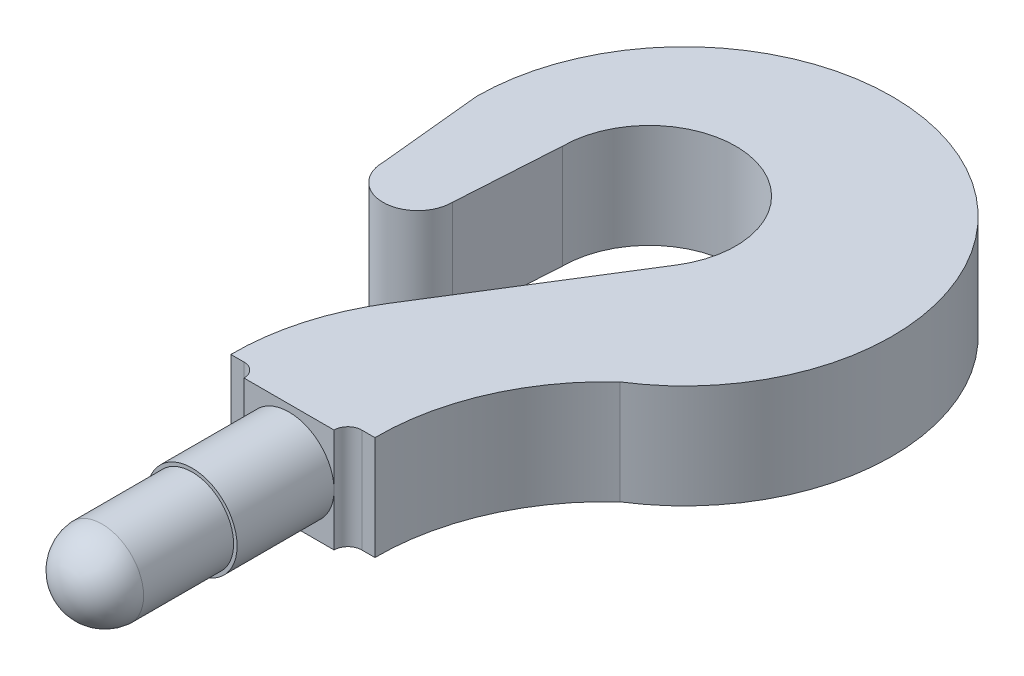
ISO-10303-21;
HEADER;
FILE_DESCRIPTION(('STEP AP214'),'2;1');
FILE_NAME('part.step','',(''),(''),'','','');
FILE_SCHEMA(('AUTOMOTIVE_DESIGN { 1 0 10303 214 1 1 1 1 }'));
ENDSEC;
DATA;
#1=APPLICATION_CONTEXT('core data for automotive mechanical design processes');
#2=APPLICATION_PROTOCOL_DEFINITION('international standard','automotive_design',2000,#1);
#3=PRODUCT_CONTEXT('',#1,'mechanical');
#4=PRODUCT('Part','Part','',(#3));
#5=PRODUCT_RELATED_PRODUCT_CATEGORY('part','',(#4));
#6=PRODUCT_DEFINITION_FORMATION('','',#4);
#7=PRODUCT_DEFINITION_CONTEXT('part definition',#1,'design');
#8=PRODUCT_DEFINITION('design','',#6,#7);
#9=PRODUCT_DEFINITION_SHAPE('','',#8);
#10=(LENGTH_UNIT() NAMED_UNIT(*) SI_UNIT(.MILLI.,.METRE.));
#11=(NAMED_UNIT(*) PLANE_ANGLE_UNIT() SI_UNIT($,.RADIAN.));
#12=(NAMED_UNIT(*) SI_UNIT($,.STERADIAN.) SOLID_ANGLE_UNIT());
#13=UNCERTAINTY_MEASURE_WITH_UNIT(LENGTH_MEASURE(1.E-05),#10,'distance_accuracy_value','');
#14=(GEOMETRIC_REPRESENTATION_CONTEXT(3) GLOBAL_UNCERTAINTY_ASSIGNED_CONTEXT((#13)) GLOBAL_UNIT_ASSIGNED_CONTEXT((#10,
#11,#12)) REPRESENTATION_CONTEXT('',''));
#15=CARTESIAN_POINT('',(0.,0.,0.));
#16=DIRECTION('',(0.,0.,1.));
#17=DIRECTION('',(1.,0.,0.));
#18=AXIS2_PLACEMENT_3D('',#15,#16,#17);
#19=CARTESIAN_POINT('',(0.,0.,14.));
#20=DIRECTION('',(0.,0.,-1.));
#21=DIRECTION('',(-1.,0.,0.));
#22=AXIS2_PLACEMENT_3D('',#19,#20,#21);
#23=CYLINDRICAL_SURFACE('',#22,6.5);
#24=CARTESIAN_POINT('',(0.,0.,14.));
#25=DIRECTION('',(0.,0.,1.));
#26=DIRECTION('',(1.,0.,0.));
#27=AXIS2_PLACEMENT_3D('',#24,#25,#26);
#28=CIRCLE('',#27,6.5);
#29=CARTESIAN_POINT('',(6.5,0.,14.));
#30=VERTEX_POINT('',#29);
#31=EDGE_CURVE('E182',#30,#30,#28,.T.);
#32=ORIENTED_EDGE('',*,*,#31,.F.);
#33=EDGE_LOOP('',(#32));
#34=FACE_BOUND('',#33,.T.);
#35=CARTESIAN_POINT('',(0.,0.,0.));
#36=DIRECTION('',(0.,0.,1.));
#37=DIRECTION('',(1.,0.,0.));
#38=AXIS2_PLACEMENT_3D('',#35,#36,#37);
#39=CIRCLE('',#38,6.5);
#40=CARTESIAN_POINT('',(6.5,0.,0.));
#41=VERTEX_POINT('',#40);
#42=CARTESIAN_POINT('',(-6.5,0.,0.));
#43=VERTEX_POINT('',#42);
#44=EDGE_CURVE('E160',#41,#43,#39,.T.);
#45=ORIENTED_EDGE('',*,*,#44,.T.);
#46=EDGE_CURVE('E180',#43,#41,#39,.T.);
#47=ORIENTED_EDGE('',*,*,#46,.T.);
#48=EDGE_LOOP('',(#45,#47));
#49=FACE_BOUND('',#48,.T.);
#50=ADVANCED_FACE('F43',(#34,#49),#23,.T.);
#51=CARTESIAN_POINT('',(0.,0.,14.));
#52=DIRECTION('',(0.,0.,1.));
#53=DIRECTION('',(1.,0.,0.));
#54=AXIS2_PLACEMENT_3D('',#51,#52,#53);
#55=PLANE('',#54);
#56=CARTESIAN_POINT('',(0.,0.,14.));
#57=DIRECTION('',(0.,0.,1.));
#58=DIRECTION('',(1.,0.,0.));
#59=AXIS2_PLACEMENT_3D('',#56,#57,#58);
#60=CIRCLE('',#59,6.);
#61=CARTESIAN_POINT('',(-6.,0.,14.));
#62=VERTEX_POINT('',#61);
#63=EDGE_CURVE('E177',#62,#62,#60,.T.);
#64=ORIENTED_EDGE('',*,*,#63,.F.);
#65=EDGE_LOOP('',(#64));
#66=FACE_BOUND('',#65,.T.);
#67=ORIENTED_EDGE('',*,*,#31,.T.);
#68=EDGE_LOOP('',(#67));
#69=FACE_BOUND('',#68,.T.);
#70=ADVANCED_FACE('F318',(#66,#69),#55,.T.);
#71=CARTESIAN_POINT('',(0.,0.,27.));
#72=DIRECTION('',(0.,0.,-1.));
#73=DIRECTION('',(-1.,0.,0.));
#74=AXIS2_PLACEMENT_3D('',#71,#72,#73);
#75=CYLINDRICAL_SURFACE('',#74,6.);
#76=CARTESIAN_POINT('',(0.,0.,27.));
#77=DIRECTION('',(0.,0.,1.));
#78=DIRECTION('',(1.,0.,0.));
#79=AXIS2_PLACEMENT_3D('',#76,#77,#78);
#80=CIRCLE('',#79,6.);
#81=CARTESIAN_POINT('',(-6.,0.,27.));
#82=VERTEX_POINT('',#81);
#83=EDGE_CURVE('E164',#82,#82,#80,.T.);
#84=CARTESIAN_POINT('',(-6.,0.,27.));
#85=CARTESIAN_POINT('',(-6.,0.,26.8645833333333));
#86=CARTESIAN_POINT('',(-6.,0.,26.7291666666667));
#87=CARTESIAN_POINT('',(-6.,0.,26.4583333333333));
#88=CARTESIAN_POINT('',(-6.,0.,26.3229166666667));
#89=CARTESIAN_POINT('',(-6.,0.,26.0520833333333));
#90=CARTESIAN_POINT('',(-6.,0.,25.9166666666667));
#91=CARTESIAN_POINT('',(-6.,0.,25.6458333333333));
#92=CARTESIAN_POINT('',(-6.,0.,25.5104166666667));
#93=CARTESIAN_POINT('',(-6.,0.,25.2395833333333));
#94=CARTESIAN_POINT('',(-6.,0.,25.1041666666667));
#95=CARTESIAN_POINT('',(-6.,0.,24.8333333333333));
#96=CARTESIAN_POINT('',(-6.,0.,24.6979166666667));
#97=CARTESIAN_POINT('',(-6.,0.,24.4270833333333));
#98=CARTESIAN_POINT('',(-6.,0.,24.2916666666667));
#99=CARTESIAN_POINT('',(-6.,0.,24.0208333333333));
#100=CARTESIAN_POINT('',(-6.,0.,23.8854166666667));
#101=CARTESIAN_POINT('',(-6.,0.,23.6145833333333));
#102=CARTESIAN_POINT('',(-6.,0.,23.4791666666667));
#103=CARTESIAN_POINT('',(-6.,0.,23.2083333333333));
#104=CARTESIAN_POINT('',(-6.,0.,23.0729166666667));
#105=CARTESIAN_POINT('',(-6.,0.,22.8020833333333));
#106=CARTESIAN_POINT('',(-6.,0.,22.6666666666667));
#107=CARTESIAN_POINT('',(-6.,0.,22.3958333333333));
#108=CARTESIAN_POINT('',(-6.,0.,22.2604166666667));
#109=CARTESIAN_POINT('',(-6.,0.,21.9895833333333));
#110=CARTESIAN_POINT('',(-6.,0.,21.8541666666667));
#111=CARTESIAN_POINT('',(-6.,0.,21.5833333333333));
#112=CARTESIAN_POINT('',(-6.,0.,21.4479166666667));
#113=CARTESIAN_POINT('',(-6.,0.,21.1770833333333));
#114=CARTESIAN_POINT('',(-6.,0.,21.0416666666667));
#115=CARTESIAN_POINT('',(-6.,0.,20.7708333333333));
#116=CARTESIAN_POINT('',(-6.,0.,20.6354166666667));
#117=CARTESIAN_POINT('',(-6.,0.,20.3645833333333));
#118=CARTESIAN_POINT('',(-6.,0.,20.2291666666667));
#119=CARTESIAN_POINT('',(-6.,0.,19.9583333333333));
#120=CARTESIAN_POINT('',(-6.,0.,19.8229166666667));
#121=CARTESIAN_POINT('',(-6.,0.,19.5520833333333));
#122=CARTESIAN_POINT('',(-6.,0.,19.4166666666667));
#123=CARTESIAN_POINT('',(-6.,0.,19.1458333333333));
#124=CARTESIAN_POINT('',(-6.,0.,19.0104166666667));
#125=CARTESIAN_POINT('',(-6.,0.,18.7395833333333));
#126=CARTESIAN_POINT('',(-6.,0.,18.6041666666667));
#127=CARTESIAN_POINT('',(-6.,0.,18.3333333333333));
#128=CARTESIAN_POINT('',(-6.,0.,18.1979166666667));
#129=CARTESIAN_POINT('',(-6.,0.,17.9270833333333));
#130=CARTESIAN_POINT('',(-6.,0.,17.7916666666667));
#131=CARTESIAN_POINT('',(-6.,0.,17.5208333333333));
#132=CARTESIAN_POINT('',(-6.,0.,17.3854166666667));
#133=CARTESIAN_POINT('',(-6.,0.,17.1145833333333));
#134=CARTESIAN_POINT('',(-6.,0.,16.9791666666667));
#135=CARTESIAN_POINT('',(-6.,0.,16.7083333333333));
#136=CARTESIAN_POINT('',(-6.,0.,16.5729166666667));
#137=CARTESIAN_POINT('',(-6.,0.,16.3020833333333));
#138=CARTESIAN_POINT('',(-6.,0.,16.1666666666667));
#139=CARTESIAN_POINT('',(-6.,0.,15.8958333333333));
#140=CARTESIAN_POINT('',(-6.,0.,15.7604166666667));
#141=CARTESIAN_POINT('',(-6.,0.,15.4895833333333));
#142=CARTESIAN_POINT('',(-6.,0.,15.3541666666667));
#143=CARTESIAN_POINT('',(-6.,0.,15.0833333333333));
#144=CARTESIAN_POINT('',(-6.,0.,14.9479166666667));
#145=CARTESIAN_POINT('',(-6.,0.,14.6770833333333));
#146=CARTESIAN_POINT('',(-6.,0.,14.5416666666667));
#147=CARTESIAN_POINT('',(-6.,0.,14.2708333333333));
#148=CARTESIAN_POINT('',(-6.,0.,14.1354166666667));
#149=CARTESIAN_POINT('',(-6.,0.,14.));
#150=B_SPLINE_CURVE_WITH_KNOTS('',3,(#84,#85,#86,#87,#88,#89,#90,#91,#92,#93,#94,#95,#96,#97,
#98,#99,#100,#101,#102,#103,#104,#105,#106,#107,#108,#109,#110,#111,#112,#113,#114,#115,#116,
#117,#118,#119,#120,#121,#122,#123,#124,#125,#126,#127,#128,#129,#130,#131,#132,#133,#134,#135,
#136,#137,#138,#139,#140,#141,#142,#143,#144,#145,#146,#147,#148,#149),.UNSPECIFIED.,.F.,.F.,(4,
2,2,2,2,2,2,2,2,2,2,2,2,2,2,2,2,2,2,2,2,2,2,2,2,2,2,2,2,2,2,2,4),(0.,0.406249999999997,
0.812499999999997,1.21875,1.625,2.03125,2.4375,2.84375,3.25,3.65625,4.0625,4.46875,4.875,
5.28125,5.6875,6.09374999999999,6.5,6.90625,7.3125,7.71875,8.125,8.53125,8.93749999999999,
9.34375,9.74999999999999,10.15625,10.5625,10.96875,11.375,11.78125,12.1875,12.59375,13.),.UNSPECIFIED.);
#151=EDGE_CURVE('BSEAM326',#82,#62,#150,.T.);
#152=ORIENTED_EDGE('',*,*,#83,.F.);
#153=ORIENTED_EDGE('',*,*,#63,.T.);
#154=ORIENTED_EDGE('',*,*,#151,.T.);
#155=ORIENTED_EDGE('',*,*,#151,.F.);
#156=EDGE_LOOP('',(#152,#154,#153,#155));
#157=FACE_BOUND('',#156,.T.);
#158=ADVANCED_FACE('F326',(#157),#75,.T.);
#159=CARTESIAN_POINT('',(0.,0.,26.5964438502674));
#160=DIRECTION('',(0.,0.,1.));
#161=DIRECTION('',(1.,0.,0.));
#162=AXIS2_PLACEMENT_3D('',#159,#160,#161);
#163=SPHERICAL_SURFACE('',#162,6.01355614973262);
#164=ORIENTED_EDGE('',*,*,#83,.T.);
#165=EDGE_LOOP('',(#164));
#166=FACE_BOUND('',#165,.T.);
#167=ADVANCED_FACE('F332',(#166),#163,.T.);
#168=CARTESIAN_POINT('',(0.,7.5,0.));
#169=DIRECTION('',(0.,0.,-1.));
#170=DIRECTION('',(-1.,0.,0.));
#171=AXIS2_PLACEMENT_3D('',#168,#169,#170);
#172=PLANE('',#171);
#173=ORIENTED_EDGE('',*,*,#44,.F.);
#174=DIRECTION('',(0.,-1.,0.));
#175=VECTOR('',#174,1.);
#176=CARTESIAN_POINT('',(6.5,7.5,0.));
#177=LINE('',#176,#175);
#178=CARTESIAN_POINT('',(6.5,7.5,0.));
#179=VERTEX_POINT('',#178);
#180=EDGE_CURVE('E157',#179,#41,#177,.T.);
#181=ORIENTED_EDGE('',*,*,#180,.F.);
#182=DIRECTION('',(1.,0.,0.));
#183=VECTOR('',#182,1.);
#184=CARTESIAN_POINT('',(0.,7.5,0.));
#185=LINE('',#184,#183);
#186=CARTESIAN_POINT('',(-6.5,7.5,0.));
#187=VERTEX_POINT('',#186);
#188=EDGE_CURVE('E142',#187,#179,#185,.T.);
#189=ORIENTED_EDGE('',*,*,#188,.F.);
#190=DIRECTION('',(0.,-1.,0.));
#191=VECTOR('',#190,1.);
#192=CARTESIAN_POINT('',(-6.5,7.5,0.));
#193=LINE('',#192,#191);
#194=EDGE_CURVE('E210',#187,#43,#193,.T.);
#195=ORIENTED_EDGE('',*,*,#194,.T.);
#196=EDGE_LOOP('',(#173,#181,#189,#195));
#197=FACE_BOUND('',#196,.T.);
#198=ADVANCED_FACE('F158',(#197),#172,.F.);
#199=ORIENTED_EDGE('',*,*,#46,.F.);
#200=CARTESIAN_POINT('',(-6.5,-7.5,0.));
#201=VERTEX_POINT('',#200);
#202=EDGE_CURVE('E212',#43,#201,#193,.T.);
#203=ORIENTED_EDGE('',*,*,#202,.T.);
#204=DIRECTION('',(1.,0.,0.));
#205=VECTOR('',#204,1.);
#206=CARTESIAN_POINT('',(0.,-7.5,0.));
#207=LINE('',#206,#205);
#208=CARTESIAN_POINT('',(6.5,-7.5,0.));
#209=VERTEX_POINT('',#208);
#210=EDGE_CURVE('E237',#201,#209,#207,.T.);
#211=ORIENTED_EDGE('',*,*,#210,.T.);
#212=EDGE_CURVE('E165',#41,#209,#177,.T.);
#213=ORIENTED_EDGE('',*,*,#212,.F.);
#214=EDGE_LOOP('',(#199,#203,#211,#213));
#215=FACE_BOUND('',#214,.T.);
#216=ADVANCED_FACE('F306',(#215),#172,.F.);
#217=CARTESIAN_POINT('',(0.,7.5,-2.));
#218=DIRECTION('',(0.,0.,-1.));
#219=DIRECTION('',(-1.,0.,0.));
#220=AXIS2_PLACEMENT_3D('',#217,#218,#219);
#221=PLANE('',#220);
#222=DIRECTION('',(1.,0.,0.));
#223=VECTOR('',#222,1.);
#224=CARTESIAN_POINT('',(0.,7.5,-2.));
#225=LINE('',#224,#223);
#226=CARTESIAN_POINT('',(8.5,7.5,-2.));
#227=VERTEX_POINT('',#226);
#228=CARTESIAN_POINT('',(10.4014134236338,7.5,-2.));
#229=VERTEX_POINT('',#228);
#230=EDGE_CURVE('E152',#227,#229,#225,.T.);
#231=ORIENTED_EDGE('',*,*,#230,.F.);
#232=DIRECTION('',(0.,-1.,0.));
#233=VECTOR('',#232,1.);
#234=CARTESIAN_POINT('',(8.5,-7.5,-2.));
#235=LINE('',#234,#233);
#236=CARTESIAN_POINT('',(8.5,-7.5,-2.));
#237=VERTEX_POINT('',#236);
#238=EDGE_CURVE('E170',#227,#237,#235,.T.);
#239=ORIENTED_EDGE('',*,*,#238,.T.);
#240=DIRECTION('',(1.,0.,0.));
#241=VECTOR('',#240,1.);
#242=CARTESIAN_POINT('',(0.,-7.5,-2.));
#243=LINE('',#242,#241);
#244=CARTESIAN_POINT('',(10.4014134236338,-7.5,-2.));
#245=VERTEX_POINT('',#244);
#246=EDGE_CURVE('E235',#237,#245,#243,.T.);
#247=ORIENTED_EDGE('',*,*,#246,.T.);
#248=DIRECTION('',(0.,-1.,0.));
#249=VECTOR('',#248,1.);
#250=CARTESIAN_POINT('',(10.4014134236338,7.5,-2.));
#251=LINE('',#250,#249);
#252=EDGE_CURVE('E187',#229,#245,#251,.T.);
#253=ORIENTED_EDGE('',*,*,#252,.F.);
#254=EDGE_LOOP('',(#231,#239,#247,#253));
#255=FACE_BOUND('',#254,.T.);
#256=ADVANCED_FACE('F265',(#255),#221,.F.);
#257=CARTESIAN_POINT('',(43.4,7.5,-2.30542423293425));
#258=DIRECTION('',(0.,-1.,0.));
#259=DIRECTION('',(0.,0.,-1.));
#260=AXIS2_PLACEMENT_3D('',#257,#258,#259);
#261=CYLINDRICAL_SURFACE('',#260,33.);
#262=CARTESIAN_POINT('',(43.4,-7.5,-2.30542423293425));
#263=DIRECTION('',(0.,1.,0.));
#264=DIRECTION('',(0.,0.,1.));
#265=AXIS2_PLACEMENT_3D('',#262,#263,#264);
#266=CIRCLE('',#265,33.);
#267=CARTESIAN_POINT('',(21.139966272595,-7.5,-26.6670928632804));
#268=VERTEX_POINT('',#267);
#269=EDGE_CURVE('E232',#268,#245,#266,.T.);
#270=ORIENTED_EDGE('',*,*,#269,.F.);
#271=DIRECTION('',(0.,-1.,0.));
#272=VECTOR('',#271,1.);
#273=CARTESIAN_POINT('',(21.139966272595,7.5,-26.6670928632804));
#274=LINE('',#273,#272);
#275=CARTESIAN_POINT('',(21.139966272595,7.5,-26.6670928632804));
#276=VERTEX_POINT('',#275);
#277=EDGE_CURVE('E190',#276,#268,#274,.T.);
#278=ORIENTED_EDGE('',*,*,#277,.F.);
#279=CARTESIAN_POINT('',(43.4,7.5,-2.30542423293425));
#280=DIRECTION('',(0.,1.,0.));
#281=DIRECTION('',(0.,0.,1.));
#282=AXIS2_PLACEMENT_3D('',#279,#280,#281);
#283=CIRCLE('',#282,33.);
#284=EDGE_CURVE('E259',#276,#229,#283,.T.);
#285=ORIENTED_EDGE('',*,*,#284,.T.);
#286=ORIENTED_EDGE('',*,*,#252,.T.);
#287=EDGE_LOOP('',(#270,#278,#285,#286));
#288=FACE_BOUND('',#287,.T.);
#289=ADVANCED_FACE('F269',(#288),#261,.F.);
#290=CARTESIAN_POINT('',(5.07,7.5,-52.));
#291=DIRECTION('',(0.,-1.,0.));
#292=DIRECTION('',(0.,0.,-1.));
#293=AXIS2_PLACEMENT_3D('',#290,#291,#292);
#294=CYLINDRICAL_SURFACE('',#293,30.);
#295=CARTESIAN_POINT('',(5.07,-7.5,-52.));
#296=DIRECTION('',(0.,1.,0.));
#297=DIRECTION('',(0.,0.,1.));
#298=AXIS2_PLACEMENT_3D('',#295,#296,#297);
#299=CIRCLE('',#298,30.);
#300=CARTESIAN_POINT('',(-24.93,-7.5,-51.9999999999998));
#301=VERTEX_POINT('',#300);
#302=EDGE_CURVE('E230',#268,#301,#299,.T.);
#303=ORIENTED_EDGE('',*,*,#302,.T.);
#304=DIRECTION('',(0.,-1.,0.));
#305=VECTOR('',#304,1.);
#306=CARTESIAN_POINT('',(-24.93,7.5,-51.9999999999998));
#307=LINE('',#306,#305);
#308=CARTESIAN_POINT('',(-24.93,7.5,-51.9999999999998));
#309=VERTEX_POINT('',#308);
#310=EDGE_CURVE('E192',#309,#301,#307,.T.);
#311=ORIENTED_EDGE('',*,*,#310,.F.);
#312=CARTESIAN_POINT('',(5.07,7.5,-52.));
#313=DIRECTION('',(0.,1.,0.));
#314=DIRECTION('',(0.,0.,1.));
#315=AXIS2_PLACEMENT_3D('',#312,#313,#314);
#316=CIRCLE('',#315,30.);
#317=EDGE_CURVE('E257',#276,#309,#316,.T.);
#318=ORIENTED_EDGE('',*,*,#317,.F.);
#319=ORIENTED_EDGE('',*,*,#277,.T.);
#320=EDGE_LOOP('',(#303,#311,#318,#319));
#321=FACE_BOUND('',#320,.T.);
#322=ADVANCED_FACE('F274',(#321),#294,.T.);
#323=CARTESIAN_POINT('',(-19.5346534653465,7.5,1.95346534653468));
#324=DIRECTION('',(0.995037190209989,0.,-0.0995037190210004));
#325=DIRECTION('',(-0.0995037190210004,0.,-0.995037190209989));
#326=AXIS2_PLACEMENT_3D('',#323,#324,#325);
#327=PLANE('',#326);
#328=DIRECTION('',(0.0995037190210004,0.,0.995037190209989));
#329=VECTOR('',#328,1.);
#330=CARTESIAN_POINT('',(-19.5346534653465,-7.5,1.95346534653468));
#331=LINE('',#330,#329);
#332=CARTESIAN_POINT('',(-23.43,-7.5,-37.));
#333=VERTEX_POINT('',#332);
#334=EDGE_CURVE('E228',#301,#333,#331,.T.);
#335=ORIENTED_EDGE('',*,*,#334,.T.);
#336=DIRECTION('',(0.,-1.,0.));
#337=VECTOR('',#336,1.);
#338=CARTESIAN_POINT('',(-23.43,7.5,-37.));
#339=LINE('',#338,#337);
#340=CARTESIAN_POINT('',(-23.43,7.5,-37.));
#341=VERTEX_POINT('',#340);
#342=EDGE_CURVE('E195',#341,#333,#339,.T.);
#343=ORIENTED_EDGE('',*,*,#342,.F.);
#344=DIRECTION('',(0.0995037190210004,0.,0.995037190209989));
#345=VECTOR('',#344,1.);
#346=CARTESIAN_POINT('',(-19.5346534653465,7.5,1.95346534653468));
#347=LINE('',#346,#345);
#348=EDGE_CURVE('E255',#309,#341,#347,.T.);
#349=ORIENTED_EDGE('',*,*,#348,.F.);
#350=ORIENTED_EDGE('',*,*,#310,.T.);
#351=EDGE_LOOP('',(#335,#343,#349,#350));
#352=FACE_BOUND('',#351,.T.);
#353=ADVANCED_FACE('F280',(#352),#327,.F.);
#354=CARTESIAN_POINT('',(-18.43,7.5,-37.));
#355=DIRECTION('',(0.,-1.,0.));
#356=DIRECTION('',(0.,0.,-1.));
#357=AXIS2_PLACEMENT_3D('',#354,#355,#356);
#358=CYLINDRICAL_SURFACE('',#357,5.);
#359=CARTESIAN_POINT('',(-18.43,-7.5,-37.));
#360=DIRECTION('',(0.,1.,0.));
#361=DIRECTION('',(0.,0.,1.));
#362=AXIS2_PLACEMENT_3D('',#359,#360,#361);
#363=CIRCLE('',#362,5.);
#364=CARTESIAN_POINT('',(-13.43,-7.5,-37.));
#365=VERTEX_POINT('',#364);
#366=EDGE_CURVE('E226',#333,#365,#363,.T.);
#367=ORIENTED_EDGE('',*,*,#366,.T.);
#368=DIRECTION('',(0.,-1.,0.));
#369=VECTOR('',#368,1.);
#370=CARTESIAN_POINT('',(-13.43,7.5,-37.));
#371=LINE('',#370,#369);
#372=CARTESIAN_POINT('',(-13.43,7.5,-37.));
#373=VERTEX_POINT('',#372);
#374=EDGE_CURVE('E198',#373,#365,#371,.T.);
#375=ORIENTED_EDGE('',*,*,#374,.F.);
#376=CARTESIAN_POINT('',(-18.43,7.5,-37.));
#377=DIRECTION('',(0.,1.,0.));
#378=DIRECTION('',(0.,0.,1.));
#379=AXIS2_PLACEMENT_3D('',#376,#377,#378);
#380=CIRCLE('',#379,5.);
#381=EDGE_CURVE('E253',#341,#373,#380,.T.);
#382=ORIENTED_EDGE('',*,*,#381,.F.);
#383=ORIENTED_EDGE('',*,*,#342,.T.);
#384=EDGE_LOOP('',(#367,#375,#382,#383));
#385=FACE_BOUND('',#384,.T.);
#386=ADVANCED_FACE('F284',(#385),#358,.T.);
#387=CARTESIAN_POINT('',(-15.6637883974004,7.5,-0.97115488063882));
#388=DIRECTION('',(-0.998083523435423,0.,-0.061881178452996));
#389=DIRECTION('',(-0.061881178452996,0.,0.998083523435423));
#390=AXIS2_PLACEMENT_3D('',#387,#388,#389);
#391=PLANE('',#390);
#392=DIRECTION('',(0.061881178452996,0.,-0.998083523435423));
#393=VECTOR('',#392,1.);
#394=CARTESIAN_POINT('',(-15.6637883974004,-7.5,-0.97115488063882));
#395=LINE('',#394,#393);
#396=CARTESIAN_POINT('',(-12.5,-7.5,-52.));
#397=VERTEX_POINT('',#396);
#398=EDGE_CURVE('E223',#365,#397,#395,.T.);
#399=ORIENTED_EDGE('',*,*,#398,.T.);
#400=DIRECTION('',(0.,-1.,0.));
#401=VECTOR('',#400,1.);
#402=CARTESIAN_POINT('',(-12.5,7.5,-52.));
#403=LINE('',#402,#401);
#404=CARTESIAN_POINT('',(-12.5,7.5,-52.));
#405=VERTEX_POINT('',#404);
#406=EDGE_CURVE('E201',#405,#397,#403,.T.);
#407=ORIENTED_EDGE('',*,*,#406,.F.);
#408=DIRECTION('',(0.061881178452996,0.,-0.998083523435423));
#409=VECTOR('',#408,1.);
#410=CARTESIAN_POINT('',(-15.6637883974004,7.5,-0.97115488063882));
#411=LINE('',#410,#409);
#412=EDGE_CURVE('E251',#373,#405,#411,.T.);
#413=ORIENTED_EDGE('',*,*,#412,.F.);
#414=ORIENTED_EDGE('',*,*,#374,.T.);
#415=EDGE_LOOP('',(#399,#407,#413,#414));
#416=FACE_BOUND('',#415,.T.);
#417=ADVANCED_FACE('F289',(#416),#391,.F.);
#418=CARTESIAN_POINT('',(0.,7.5,-52.));
#419=DIRECTION('',(0.,-1.,0.));
#420=DIRECTION('',(0.,0.,-1.));
#421=AXIS2_PLACEMENT_3D('',#418,#419,#420);
#422=CYLINDRICAL_SURFACE('',#421,12.5);
#423=CARTESIAN_POINT('',(0.,-7.5,-52.));
#424=DIRECTION('',(0.,1.,0.));
#425=DIRECTION('',(0.,0.,1.));
#426=AXIS2_PLACEMENT_3D('',#423,#424,#425);
#427=CIRCLE('',#426,12.5);
#428=CARTESIAN_POINT('',(10.6006012019553,-7.5,-45.3760091970849));
#429=VERTEX_POINT('',#428);
#430=EDGE_CURVE('E220',#429,#397,#427,.T.);
#431=ORIENTED_EDGE('',*,*,#430,.F.);
#432=DIRECTION('',(0.,-1.,0.));
#433=VECTOR('',#432,1.);
#434=CARTESIAN_POINT('',(10.6006012019553,7.5,-45.3760091970849));
#435=LINE('',#434,#433);
#436=CARTESIAN_POINT('',(10.6006012019553,7.5,-45.3760091970849));
#437=VERTEX_POINT('',#436);
#438=EDGE_CURVE('E203',#437,#429,#435,.T.);
#439=ORIENTED_EDGE('',*,*,#438,.F.);
#440=CARTESIAN_POINT('',(0.,7.5,-52.));
#441=DIRECTION('',(0.,1.,0.));
#442=DIRECTION('',(0.,0.,1.));
#443=AXIS2_PLACEMENT_3D('',#440,#441,#442);
#444=CIRCLE('',#443,12.5);
#445=EDGE_CURVE('E248',#437,#405,#444,.T.);
#446=ORIENTED_EDGE('',*,*,#445,.T.);
#447=ORIENTED_EDGE('',*,*,#406,.T.);
#448=EDGE_LOOP('',(#431,#439,#446,#447));
#449=FACE_BOUND('',#448,.T.);
#450=ADVANCED_FACE('F308',(#449),#422,.F.);
#451=CARTESIAN_POINT('',(-12.7680440018231,7.5,-7.97835938056899));
#452=DIRECTION('',(-0.848048096156425,0.,-0.529919264233207));
#453=DIRECTION('',(-0.529919264233207,0.,0.848048096156425));
#454=AXIS2_PLACEMENT_3D('',#451,#452,#453);
#455=PLANE('',#454);
#456=DIRECTION('',(0.529919264233206,0.,-0.848048096156425));
#457=VECTOR('',#456,1.);
#458=CARTESIAN_POINT('',(-12.7680440018231,-7.5,-7.97835938056899));
#459=LINE('',#458,#457);
#460=CARTESIAN_POINT('',(-5.38558717316205,-7.5,-19.7927599526301));
#461=VERTEX_POINT('',#460);
#462=EDGE_CURVE('E217',#461,#429,#459,.T.);
#463=ORIENTED_EDGE('',*,*,#462,.F.);
#464=DIRECTION('',(0.,-1.,0.));
#465=VECTOR('',#464,1.);
#466=CARTESIAN_POINT('',(-5.38558717316205,7.5,-19.7927599526301));
#467=LINE('',#466,#465);
#468=CARTESIAN_POINT('',(-5.38558717316205,7.5,-19.7927599526301));
#469=VERTEX_POINT('',#468);
#470=EDGE_CURVE('E205',#469,#461,#467,.T.);
#471=ORIENTED_EDGE('',*,*,#470,.F.);
#472=DIRECTION('',(0.529919264233206,0.,-0.848048096156425));
#473=VECTOR('',#472,1.);
#474=CARTESIAN_POINT('',(-12.7680440018231,7.5,-7.97835938056899));
#475=LINE('',#474,#473);
#476=EDGE_CURVE('E245',#469,#437,#475,.T.);
#477=ORIENTED_EDGE('',*,*,#476,.T.);
#478=ORIENTED_EDGE('',*,*,#438,.T.);
#479=EDGE_LOOP('',(#463,#471,#477,#478));
#480=FACE_BOUND('',#479,.T.);
#481=ADVANCED_FACE('F295',(#480),#455,.T.);
#482=CARTESIAN_POINT('',(22.6,7.5,-2.30542423293425));
#483=DIRECTION('',(0.,-1.,0.));
#484=DIRECTION('',(0.,0.,-1.));
#485=AXIS2_PLACEMENT_3D('',#482,#483,#484);
#486=CYLINDRICAL_SURFACE('',#485,33.);
#487=CARTESIAN_POINT('',(22.6,-7.5,-2.30542423293425));
#488=DIRECTION('',(0.,1.,0.));
#489=DIRECTION('',(0.,0.,1.));
#490=AXIS2_PLACEMENT_3D('',#487,#488,#489);
#491=CIRCLE('',#490,33.);
#492=CARTESIAN_POINT('',(-10.3985865763662,-7.5,-2.));
#493=VERTEX_POINT('',#492);
#494=EDGE_CURVE('E214',#461,#493,#491,.T.);
#495=ORIENTED_EDGE('',*,*,#494,.T.);
#496=DIRECTION('',(0.,-1.,0.));
#497=VECTOR('',#496,1.);
#498=CARTESIAN_POINT('',(-10.3985865763662,7.5,-2.));
#499=LINE('',#498,#497);
#500=CARTESIAN_POINT('',(-10.3985865763662,7.5,-2.));
#501=VERTEX_POINT('',#500);
#502=EDGE_CURVE('E207',#501,#493,#499,.T.);
#503=ORIENTED_EDGE('',*,*,#502,.F.);
#504=CARTESIAN_POINT('',(22.6,7.5,-2.30542423293425));
#505=DIRECTION('',(0.,1.,0.));
#506=DIRECTION('',(0.,0.,1.));
#507=AXIS2_PLACEMENT_3D('',#504,#505,#506);
#508=CIRCLE('',#507,33.);
#509=EDGE_CURVE('E242',#469,#501,#508,.T.);
#510=ORIENTED_EDGE('',*,*,#509,.F.);
#511=ORIENTED_EDGE('',*,*,#470,.T.);
#512=EDGE_LOOP('',(#495,#503,#510,#511));
#513=FACE_BOUND('',#512,.T.);
#514=ADVANCED_FACE('F301',(#513),#486,.T.);
#515=CARTESIAN_POINT('',(0.,7.5,-2.));
#516=DIRECTION('',(0.,0.,1.));
#517=DIRECTION('',(1.,0.,0.));
#518=AXIS2_PLACEMENT_3D('',#515,#516,#517);
#519=PLANE('',#518);
#520=DIRECTION('',(-1.,0.,0.));
#521=VECTOR('',#520,1.);
#522=CARTESIAN_POINT('',(0.,-7.5,-2.));
#523=LINE('',#522,#521);
#524=CARTESIAN_POINT('',(-8.5,-7.5,-2.));
#525=VERTEX_POINT('',#524);
#526=EDGE_CURVE('E153',#525,#493,#523,.T.);
#527=ORIENTED_EDGE('',*,*,#526,.F.);
#528=DIRECTION('',(0.,-1.,0.));
#529=VECTOR('',#528,1.);
#530=CARTESIAN_POINT('',(-8.5,7.5,-2.));
#531=LINE('',#530,#529);
#532=CARTESIAN_POINT('',(-8.5,7.5,-2.));
#533=VERTEX_POINT('',#532);
#534=EDGE_CURVE('E58',#525,#533,#531,.F.);
#535=ORIENTED_EDGE('',*,*,#534,.T.);
#536=DIRECTION('',(-1.,0.,0.));
#537=VECTOR('',#536,1.);
#538=CARTESIAN_POINT('',(0.,7.5,-2.));
#539=LINE('',#538,#537);
#540=EDGE_CURVE('E240',#533,#501,#539,.T.);
#541=ORIENTED_EDGE('',*,*,#540,.T.);
#542=ORIENTED_EDGE('',*,*,#502,.T.);
#543=EDGE_LOOP('',(#527,#535,#541,#542));
#544=FACE_BOUND('',#543,.T.);
#545=ADVANCED_FACE('F344',(#544),#519,.T.);
#546=CARTESIAN_POINT('',(0.,7.5,0.));
#547=DIRECTION('',(0.,1.,0.));
#548=DIRECTION('',(0.,0.,1.));
#549=AXIS2_PLACEMENT_3D('',#546,#547,#548);
#550=PLANE('',#549);
#551=ORIENTED_EDGE('',*,*,#188,.T.);
#552=CARTESIAN_POINT('',(8.5,7.5,0.));
#553=DIRECTION('',(0.,1.,0.));
#554=DIRECTION('',(0.,0.,1.));
#555=AXIS2_PLACEMENT_3D('',#552,#553,#554);
#556=CIRCLE('',#555,2.);
#557=EDGE_CURVE('E146',#179,#227,#556,.F.);
#558=ORIENTED_EDGE('',*,*,#557,.T.);
#559=ORIENTED_EDGE('',*,*,#230,.T.);
#560=ORIENTED_EDGE('',*,*,#284,.F.);
#561=ORIENTED_EDGE('',*,*,#317,.T.);
#562=ORIENTED_EDGE('',*,*,#348,.T.);
#563=ORIENTED_EDGE('',*,*,#381,.T.);
#564=ORIENTED_EDGE('',*,*,#412,.T.);
#565=ORIENTED_EDGE('',*,*,#445,.F.);
#566=ORIENTED_EDGE('',*,*,#476,.F.);
#567=ORIENTED_EDGE('',*,*,#509,.T.);
#568=ORIENTED_EDGE('',*,*,#540,.F.);
#569=CARTESIAN_POINT('',(-8.5,7.5,0.));
#570=DIRECTION('',(0.,1.,0.));
#571=DIRECTION('',(0.,0.,1.));
#572=AXIS2_PLACEMENT_3D('',#569,#570,#571);
#573=CIRCLE('',#572,2.);
#574=EDGE_CURVE('E11',#533,#187,#573,.F.);
#575=ORIENTED_EDGE('',*,*,#574,.T.);
#576=EDGE_LOOP('',(#551,#558,#559,#560,#561,#562,#563,#564,#565,#566,#567,#568,#575));
#577=FACE_BOUND('',#576,.T.);
#578=ADVANCED_FACE('F144',(#577),#550,.T.);
#579=CARTESIAN_POINT('',(0.,-7.5,0.));
#580=DIRECTION('',(0.,1.,0.));
#581=DIRECTION('',(0.,0.,1.));
#582=AXIS2_PLACEMENT_3D('',#579,#580,#581);
#583=PLANE('',#582);
#584=ORIENTED_EDGE('',*,*,#210,.F.);
#585=CARTESIAN_POINT('',(-8.5,-7.5,0.));
#586=DIRECTION('',(0.,1.,0.));
#587=DIRECTION('',(0.,0.,1.));
#588=AXIS2_PLACEMENT_3D('',#585,#586,#587);
#589=CIRCLE('',#588,2.);
#590=EDGE_CURVE('E51',#201,#525,#589,.T.);
#591=ORIENTED_EDGE('',*,*,#590,.T.);
#592=ORIENTED_EDGE('',*,*,#526,.T.);
#593=ORIENTED_EDGE('',*,*,#494,.F.);
#594=ORIENTED_EDGE('',*,*,#462,.T.);
#595=ORIENTED_EDGE('',*,*,#430,.T.);
#596=ORIENTED_EDGE('',*,*,#398,.F.);
#597=ORIENTED_EDGE('',*,*,#366,.F.);
#598=ORIENTED_EDGE('',*,*,#334,.F.);
#599=ORIENTED_EDGE('',*,*,#302,.F.);
#600=ORIENTED_EDGE('',*,*,#269,.T.);
#601=ORIENTED_EDGE('',*,*,#246,.F.);
#602=CARTESIAN_POINT('',(8.5,-7.5,0.));
#603=DIRECTION('',(0.,1.,0.));
#604=DIRECTION('',(0.,0.,1.));
#605=AXIS2_PLACEMENT_3D('',#602,#603,#604);
#606=CIRCLE('',#605,2.);
#607=EDGE_CURVE('E171',#237,#209,#606,.T.);
#608=ORIENTED_EDGE('',*,*,#607,.T.);
#609=EDGE_LOOP('',(#584,#591,#592,#593,#594,#595,#596,#597,#598,#599,#600,#601,#608));
#610=FACE_BOUND('',#609,.T.);
#611=ADVANCED_FACE('F307',(#610),#583,.F.);
#612=CARTESIAN_POINT('',(8.5,7.5,0.));
#613=DIRECTION('',(0.,1.,0.));
#614=DIRECTION('',(0.,0.,1.));
#615=AXIS2_PLACEMENT_3D('',#612,#613,#614);
#616=CYLINDRICAL_SURFACE('',#615,2.);
#617=ORIENTED_EDGE('',*,*,#180,.T.);
#618=ORIENTED_EDGE('',*,*,#212,.T.);
#619=ORIENTED_EDGE('',*,*,#607,.F.);
#620=ORIENTED_EDGE('',*,*,#238,.F.);
#621=ORIENTED_EDGE('',*,*,#557,.F.);
#622=EDGE_LOOP('',(#617,#618,#619,#620,#621));
#623=FACE_BOUND('',#622,.T.);
#624=ADVANCED_FACE('F168',(#623),#616,.F.);
#625=CARTESIAN_POINT('',(-8.5,7.5,0.));
#626=DIRECTION('',(0.,1.,0.));
#627=DIRECTION('',(0.,0.,1.));
#628=AXIS2_PLACEMENT_3D('',#625,#626,#627);
#629=CYLINDRICAL_SURFACE('',#628,2.);
#630=ORIENTED_EDGE('',*,*,#574,.F.);
#631=ORIENTED_EDGE('',*,*,#534,.F.);
#632=ORIENTED_EDGE('',*,*,#590,.F.);
#633=ORIENTED_EDGE('',*,*,#202,.F.);
#634=ORIENTED_EDGE('',*,*,#194,.F.);
#635=EDGE_LOOP('',(#630,#631,#632,#633,#634));
#636=FACE_BOUND('',#635,.T.);
#637=ADVANCED_FACE('F45',(#636),#629,.F.);
#638=CLOSED_SHELL('',(#50,#70,#158,#167,#198,#216,#256,#289,#322,#353,#386,#417,#450,#481,#514,
#545,#578,#611,#624,#637));
#639=MANIFOLD_SOLID_BREP('B2',#638);
#640=ADVANCED_BREP_SHAPE_REPRESENTATION('',(#18,#639),#14);
#641=SHAPE_DEFINITION_REPRESENTATION(#9,#640);
ENDSEC;
END-ISO-10303-21;
